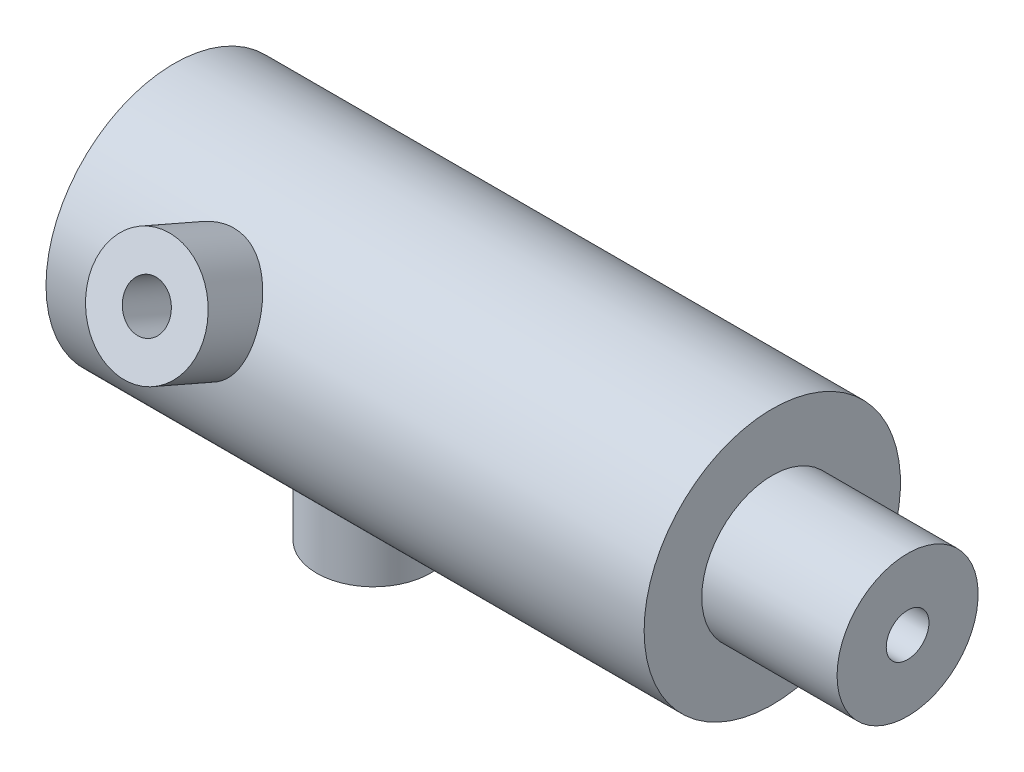
ISO-10303-21;
HEADER;
FILE_DESCRIPTION(('STEP AP214'),'2;1');
FILE_NAME('part.step','',(''),(''),'','','');
FILE_SCHEMA(('AUTOMOTIVE_DESIGN { 1 0 10303 214 1 1 1 1 }'));
ENDSEC;
DATA;
#1=APPLICATION_CONTEXT('core data for automotive mechanical design processes');
#2=APPLICATION_PROTOCOL_DEFINITION('international standard','automotive_design',2000,#1);
#3=PRODUCT_CONTEXT('',#1,'mechanical');
#4=PRODUCT('Part','Part','',(#3));
#5=PRODUCT_RELATED_PRODUCT_CATEGORY('part','',(#4));
#6=PRODUCT_DEFINITION_FORMATION('','',#4);
#7=PRODUCT_DEFINITION_CONTEXT('part definition',#1,'design');
#8=PRODUCT_DEFINITION('design','',#6,#7);
#9=PRODUCT_DEFINITION_SHAPE('','',#8);
#10=(LENGTH_UNIT() NAMED_UNIT(*) SI_UNIT(.MILLI.,.METRE.));
#11=(NAMED_UNIT(*) PLANE_ANGLE_UNIT() SI_UNIT($,.RADIAN.));
#12=(NAMED_UNIT(*) SI_UNIT($,.STERADIAN.) SOLID_ANGLE_UNIT());
#13=UNCERTAINTY_MEASURE_WITH_UNIT(LENGTH_MEASURE(1.E-05),#10,'distance_accuracy_value','');
#14=(GEOMETRIC_REPRESENTATION_CONTEXT(3) GLOBAL_UNCERTAINTY_ASSIGNED_CONTEXT((#13)) GLOBAL_UNIT_ASSIGNED_CONTEXT((#10,
#11,#12)) REPRESENTATION_CONTEXT('',''));
#15=CARTESIAN_POINT('',(0.,0.,0.));
#16=DIRECTION('',(0.,0.,1.));
#17=DIRECTION('',(1.,0.,0.));
#18=AXIS2_PLACEMENT_3D('',#15,#16,#17);
#19=CARTESIAN_POINT('',(-300.,0.,0.));
#20=DIRECTION('',(-1.,0.,0.));
#21=DIRECTION('',(0.,0.,1.));
#22=AXIS2_PLACEMENT_3D('',#19,#20,#21);
#23=CYLINDRICAL_SURFACE('',#22,5.);
#24=CARTESIAN_POINT('',(-32.,2.44382561417905,4.36207707032812));
#25=CARTESIAN_POINT('',(-31.9719902179132,2.44382463275468,4.36207785568874));
#26=CARTESIAN_POINT('',(-31.9439619157941,2.44175566384853,4.36323874560043));
#27=CARTESIAN_POINT('',(-31.8886824068532,2.43352551554042,4.3678341224768));
#28=CARTESIAN_POINT('',(-31.8614320909813,2.42735982634019,4.37127111503287));
#29=CARTESIAN_POINT('',(-31.808517090391,2.41109414480081,4.38026378861444));
#30=CARTESIAN_POINT('',(-31.7828514553043,2.40099653760197,4.38581818515895));
#31=CARTESIAN_POINT('',(-31.7338161038541,2.37712253104768,4.39880350084775));
#32=CARTESIAN_POINT('',(-31.7104459327581,2.36334686233681,4.40623404728015));
#33=CARTESIAN_POINT('',(-31.6665743681713,2.33240978051684,4.42268828494558));
#34=CARTESIAN_POINT('',(-31.6460824952481,2.31523756360443,4.43171704993643));
#35=CARTESIAN_POINT('',(-31.6086311954982,2.27796902355845,4.4509882388944));
#36=CARTESIAN_POINT('',(-31.5916719302968,2.25787256670523,4.46123071835827));
#37=CARTESIAN_POINT('',(-31.5617343714964,2.21522776625406,4.48255893760507));
#38=CARTESIAN_POINT('',(-31.5487645006032,2.19267436940354,4.49364640067073));
#39=CARTESIAN_POINT('',(-31.5272277834257,2.14574907747121,4.51624161171895));
#40=CARTESIAN_POINT('',(-31.5186608298153,2.12137722673287,4.52774934944951));
#41=CARTESIAN_POINT('',(-31.5062010453234,2.07156630569769,4.55075408145723));
#42=CARTESIAN_POINT('',(-31.502292583625,2.04613110240243,4.56225098159007));
#43=CARTESIAN_POINT('',(-31.4992123654331,1.99483060667151,4.58491406916804));
#44=CARTESIAN_POINT('',(-31.5000404861269,1.96896532540449,4.5960802651803));
#45=CARTESIAN_POINT('',(-31.5063972363251,1.91763947835882,4.6177301901766));
#46=CARTESIAN_POINT('',(-31.5119090577819,1.89217779661695,4.62821621539151));
#47=CARTESIAN_POINT('',(-31.5274505644733,1.84230274731549,4.64829471637029));
#48=CARTESIAN_POINT('',(-31.5374803083938,1.81788939337778,4.65788718052521));
#49=CARTESIAN_POINT('',(-31.5617913816272,1.77078605672388,4.67599778332356));
#50=CARTESIAN_POINT('',(-31.5760801487651,1.74809917680052,4.6845140050927));
#51=CARTESIAN_POINT('',(-31.6084982616682,1.7051705524166,4.70031035009157));
#52=CARTESIAN_POINT('',(-31.6266277200726,1.68492887969602,4.70759043705685));
#53=CARTESIAN_POINT('',(-31.6663071147568,1.64741902524983,4.72084832320064));
#54=CARTESIAN_POINT('',(-31.6878716723708,1.63016424361026,4.72682028395315));
#55=CARTESIAN_POINT('',(-31.7337584326054,1.59927162738725,4.73736187595038));
#56=CARTESIAN_POINT('',(-31.7580806392261,1.5856337980504,4.74193150516095));
#57=CARTESIAN_POINT('',(-31.8088035125999,1.56240463774082,4.74963601591324));
#58=CARTESIAN_POINT('',(-31.8352046162114,1.55281415998372,4.75277059494616));
#59=CARTESIAN_POINT('',(-31.8893303023073,1.53799533502983,4.75758674149503));
#60=CARTESIAN_POINT('',(-31.9170548444437,1.53276685493748,4.7592683532781));
#61=CARTESIAN_POINT('',(-31.9729120897648,1.5268569805032,4.76116766531805));
#62=CARTESIAN_POINT('',(-32.0010425101324,1.52615602535207,4.7613916631109));
#63=CARTESIAN_POINT('',(-32.0570256329114,1.52927223396259,4.76039168632797));
#64=CARTESIAN_POINT('',(-32.0848783390702,1.53308933667538,4.75916773131721));
#65=CARTESIAN_POINT('',(-32.1394557911392,1.54510339257999,4.75528073003278));
#66=CARTESIAN_POINT('',(-32.1661827855473,1.55329111989491,4.75262071497982));
#67=CARTESIAN_POINT('',(-32.2178200258652,1.57377679328526,4.74587633809813));
#68=CARTESIAN_POINT('',(-32.2427302301436,1.58607483351131,4.74179194364255));
#69=CARTESIAN_POINT('',(-32.2901199870144,1.61444185664411,4.73220894895131));
#70=CARTESIAN_POINT('',(-32.3125909709831,1.63052354191195,4.72670557886274));
#71=CARTESIAN_POINT('',(-32.354377526637,1.66593649906017,4.71434050717992));
#72=CARTESIAN_POINT('',(-32.37369302017,1.68526785140115,4.70747877195228));
#73=CARTESIAN_POINT('',(-32.408690816699,1.72666731928342,4.69245199325041));
#74=CARTESIAN_POINT('',(-32.4243597797931,1.74874504358373,4.68428234344168));
#75=CARTESIAN_POINT('',(-32.4515279342532,1.79491566857954,4.66678544357369));
#76=CARTESIAN_POINT('',(-32.4630271827535,1.81900854165747,4.65745820937826));
#77=CARTESIAN_POINT('',(-32.4815068838277,1.86844641721031,4.63784576255884));
#78=CARTESIAN_POINT('',(-32.4884953936626,1.89378909954522,4.62756229581079));
#79=CARTESIAN_POINT('',(-32.4977815347899,1.94502034251962,4.60626367545235));
#80=CARTESIAN_POINT('',(-32.500079297917,1.97090888779684,4.59524854241463));
#81=CARTESIAN_POINT('',(-32.49991686678,2.02236904281403,4.57283366616371));
#82=CARTESIAN_POINT('',(-32.4974773815817,2.04794154241693,4.56143581006097));
#83=CARTESIAN_POINT('',(-32.4879531271715,2.09816560968047,4.53855295275411));
#84=CARTESIAN_POINT('',(-32.4808683543135,2.12281717661823,4.52706795148159));
#85=CARTESIAN_POINT('',(-32.4622603713035,2.17052260392725,4.50439004424814));
#86=CARTESIAN_POINT('',(-32.4507377665329,2.19357668171213,4.49319709866905));
#87=CARTESIAN_POINT('',(-32.4235834155415,2.23748091391932,4.47149634754273));
#88=CARTESIAN_POINT('',(-32.4079516933644,2.25833108123641,4.460988537987));
#89=CARTESIAN_POINT('',(-32.3729451904881,2.29737405692767,4.44100846885508));
#90=CARTESIAN_POINT('',(-32.3535549918776,2.31555535791982,4.43154073548685));
#91=CARTESIAN_POINT('',(-32.3116123242273,2.34869817053577,4.41406489798094));
#92=CARTESIAN_POINT('',(-32.2890590974155,2.36365890842022,4.40605714467363));
#93=CARTESIAN_POINT('',(-32.24136782904,2.39001199319932,4.39181833548115));
#94=CARTESIAN_POINT('',(-32.216223359338,2.40139516774225,4.38559185011319));
#95=CARTESIAN_POINT('',(-32.1641258543769,2.42024323287729,4.37521879375576));
#96=CARTESIAN_POINT('',(-32.1371748980372,2.42771254313307,4.37106987694381));
#97=CARTESIAN_POINT('',(-32.0917261295504,2.43668705630269,4.36607051217117));
#98=CARTESIAN_POINT('',(-32.0735188743468,2.4393607659495,4.36457595795929));
#99=CARTESIAN_POINT('',(-32.0368770884787,2.44293036425719,4.36257898056657));
#100=CARTESIAN_POINT('',(-32.0184425587687,2.44382626038103,4.36207655322095));
#101=CARTESIAN_POINT('',(-32.,2.44382561417905,4.36207707032812));
#102=B_SPLINE_CURVE_WITH_KNOTS('',3,(#24,#25,#26,#27,#28,#29,#30,#31,#32,#33,#34,#35,#36,#37,
#38,#39,#40,#41,#42,#43,#44,#45,#46,#47,#48,#49,#50,#51,#52,#53,#54,#55,#56,#57,#58,#59,#60,#61,
#62,#63,#64,#65,#66,#67,#68,#69,#70,#71,#72,#73,#74,#75,#76,#77,#78,#79,#80,#81,#82,#83,#84,#85,
#86,#87,#88,#89,#90,#91,#92,#93,#94,#95,#96,#97,#98,#99,#100,#101),.UNSPECIFIED.,.T.,.F.,(4,2,2,
2,2,2,2,2,2,2,2,2,2,2,2,2,2,2,2,2,2,2,2,2,2,2,2,2,2,2,2,2,2,2,2,2,2,2,4),(0.,0.0839619972182352,
0.168016575910885,0.252020245498734,0.336007240210655,0.420265807649624,0.504528229276266,
0.58896734985646,0.673404412038973,0.757557354492248,0.841708114991162,0.925558159093309,
1.00940929240487,1.09340772733207,1.17740862609265,1.26177712542501,1.34614574713782,
1.43053214558967,1.51491597297516,1.59893498153883,1.68295285483436,1.76679407352264,
1.85063721280524,1.93476594905859,2.01889676861602,2.10333068409059,2.18776344259003,
2.27204496347181,2.35632411556575,2.44023566734242,2.52414728498329,2.60804745997623,
2.691947144054,2.77619857518995,2.86047022517263,2.94495620535238,3.02934657447,
3.08463013803023,3.13991346951908),.UNSPECIFIED.);
#103=CARTESIAN_POINT('',(-32.,2.44382561417905,4.36207707032812));
#104=VERTEX_POINT('',#103);
#105=EDGE_CURVE('E118',#104,#104,#102,.T.);
#106=ORIENTED_EDGE('',*,*,#105,.F.);
#107=EDGE_LOOP('',(#106));
#108=FACE_BOUND('',#107,.T.);
#109=CARTESIAN_POINT('',(-6.00000000000001,0.,0.));
#110=DIRECTION('',(-1.,0.,0.));
#111=DIRECTION('',(0.,0.,1.));
#112=AXIS2_PLACEMENT_3D('',#109,#110,#111);
#113=CIRCLE('',#112,5.);
#114=CARTESIAN_POINT('',(-6.00000000000001,0.,5.));
#115=VERTEX_POINT('',#114);
#116=EDGE_CURVE('E178',#115,#115,#113,.T.);
#117=ORIENTED_EDGE('',*,*,#116,.F.);
#118=EDGE_LOOP('',(#117));
#119=FACE_BOUND('',#118,.T.);
#120=CARTESIAN_POINT('',(-33.4,0.,0.));
#121=DIRECTION('',(-1.,0.,0.));
#122=DIRECTION('',(0.,0.,1.));
#123=AXIS2_PLACEMENT_3D('',#120,#121,#122);
#124=CIRCLE('',#123,5.);
#125=CARTESIAN_POINT('',(-33.4,0.,5.));
#126=VERTEX_POINT('',#125);
#127=EDGE_CURVE('E172',#126,#126,#124,.T.);
#128=ORIENTED_EDGE('',*,*,#127,.T.);
#129=EDGE_LOOP('',(#128));
#130=FACE_BOUND('',#129,.T.);
#131=CARTESIAN_POINT('',(-28.,-4.9749371855331,0.5));
#132=CARTESIAN_POINT('',(-28.0280097820868,-4.97493751398451,0.499998786696756));
#133=CARTESIAN_POINT('',(-28.0560380842059,-4.97517628497109,0.497638429491238));
#134=CARTESIAN_POINT('',(-28.1113175931468,-4.9761054377906,0.488258157381782));
#135=CARTESIAN_POINT('',(-28.1385679090187,-4.9767963173061,0.481233107443218));
#136=CARTESIAN_POINT('',(-28.191482909609,-4.97855066523694,0.462730058034464));
#137=CARTESIAN_POINT('',(-28.2171485446957,-4.97961390773395,0.451254758146952));
#138=CARTESIAN_POINT('',(-28.2661838961459,-4.9819929028591,0.424182133695553));
#139=CARTESIAN_POINT('',(-28.2895540672419,-4.98330860532165,0.408585627812964));
#140=CARTESIAN_POINT('',(-28.3334256318288,-4.98604963354949,0.373652380999351));
#141=CARTESIAN_POINT('',(-28.3539175047519,-4.98747530002633,0.354303709054128));
#142=CARTESIAN_POINT('',(-28.3913688045018,-4.99027252617859,0.312440857659781));
#143=CARTESIAN_POINT('',(-28.4083280697032,-4.99164408337606,0.289926533453284));
#144=CARTESIAN_POINT('',(-28.4382656285036,-4.99418191577802,0.242313180825495));
#145=CARTESIAN_POINT('',(-28.4512354993968,-4.99534775447323,0.217208831264785));
#146=CARTESIAN_POINT('',(-28.4727722165743,-4.99733908437885,0.165164992143755));
#147=CARTESIAN_POINT('',(-28.4813391701847,-4.99816458388532,0.13822554733411));
#148=CARTESIAN_POINT('',(-28.4937989546766,-4.99937983285513,0.0833723913714751));
#149=CARTESIAN_POINT('',(-28.497707416375,-4.99977103921408,0.0554622635157911));
#150=CARTESIAN_POINT('',(-28.5007876345669,-5.00007857799346,-0.000620370344471064));
#151=CARTESIAN_POINT('',(-28.4999595138731,-4.99999492272636,-0.0287928695272302));
#152=CARTESIAN_POINT('',(-28.4936027636749,-4.99936335655593,-0.0844944220322795));
#153=CARTESIAN_POINT('',(-28.4880909422181,-4.99881710575856,-0.112025414967489));
#154=CARTESIAN_POINT('',(-28.4725494355267,-4.99732364632465,-0.165769589752266));
#155=CARTESIAN_POINT('',(-28.4625196916062,-4.99637643247977,-0.191982754478865));
#156=CARTESIAN_POINT('',(-28.4382086183728,-4.99418468741958,-0.242400157339793));
#157=CARTESIAN_POINT('',(-28.4239198512349,-4.99293963682879,-0.266600785490824));
#158=CARTESIAN_POINT('',(-28.3915017383318,-4.99029192259704,-0.312266756587096));
#159=CARTESIAN_POINT('',(-28.3733722799274,-4.98888925433406,-0.333732019280414));
#160=CARTESIAN_POINT('',(-28.3336928852432,-4.98607646733926,-0.373416385911345));
#161=CARTESIAN_POINT('',(-28.3121283276292,-4.98466634286514,-0.391620873095172));
#162=CARTESIAN_POINT('',(-28.2662415673946,-4.98200369964111,-0.424153767678959));
#163=CARTESIAN_POINT('',(-28.2419193607739,-4.98075118111982,-0.438482169456446));
#164=CARTESIAN_POINT('',(-28.1911964874001,-4.97854544757075,-0.462856092286616));
#165=CARTESIAN_POINT('',(-28.1647953837886,-4.97759229566277,-0.47290071028648));
#166=CARTESIAN_POINT('',(-28.1106696976927,-4.97609450935469,-0.488410367818795));
#167=CARTESIAN_POINT('',(-28.0829451555563,-4.97554986250884,-0.493875546871517));
#168=CARTESIAN_POINT('',(-28.0270879102352,-4.97493290263708,-0.50005238769598));
#169=CARTESIAN_POINT('',(-27.9989574898676,-4.97485855773802,-0.500784498323606));
#170=CARTESIAN_POINT('',(-27.9429743670886,-4.97518525677386,-0.497528123435681));
#171=CARTESIAN_POINT('',(-27.9151216609298,-4.97558629428531,-0.493539701704878));
#172=CARTESIAN_POINT('',(-27.8605442088608,-4.97681672211201,-0.48097258725376));
#173=CARTESIAN_POINT('',(-27.8338172144527,-4.97764521000673,-0.472403563594454));
#174=CARTESIAN_POINT('',(-27.7821799741348,-4.97963645519397,-0.450928359837969));
#175=CARTESIAN_POINT('',(-27.7572697698564,-4.98079922014335,-0.438022080391793));
#176=CARTESIAN_POINT('',(-27.7098800129856,-4.98333292177857,-0.408187500711608));
#177=CARTESIAN_POINT('',(-27.6874090290169,-4.98470455407336,-0.391245649920345));
#178=CARTESIAN_POINT('',(-27.645622473363,-4.98749916312593,-0.353840266725586));
#179=CARTESIAN_POINT('',(-27.62630697983,-4.98892214115433,-0.333376647124067));
#180=CARTESIAN_POINT('',(-27.591309183301,-4.99166523924651,-0.289419902113237));
#181=CARTESIAN_POINT('',(-27.5756402202069,-4.99298497027737,-0.265916127984726));
#182=CARTESIAN_POINT('',(-27.5484720657468,-4.99536721053315,-0.216598858708566));
#183=CARTESIAN_POINT('',(-27.5369728172464,-4.99642972328246,-0.190785395214813));
#184=CARTESIAN_POINT('',(-27.5184931161723,-4.99817605207003,-0.137628063216408));
#185=CARTESIAN_POINT('',(-27.5115046063374,-4.99886054302824,-0.11028701882498));
#186=CARTESIAN_POINT('',(-27.5022184652101,-4.99977647306824,-0.0548124069918401));
#187=CARTESIAN_POINT('',(-27.499920702083,-5.00000792488281,-0.0266788618461092));
#188=CARTESIAN_POINT('',(-27.50008313322,-4.99999169156635,0.0294511120378731));
#189=CARTESIAN_POINT('',(-27.5025226184183,-4.99974609188335,0.0574476036122638));
#190=CARTESIAN_POINT('',(-27.5120468728285,-4.99880746788795,0.112630944178181));
#191=CARTESIAN_POINT('',(-27.5191316456865,-4.99811444322437,0.139817792534182));
#192=CARTESIAN_POINT('',(-27.5377396286965,-4.99635861906981,0.192609954383872));
#193=CARTESIAN_POINT('',(-27.5492622334671,-4.99529587001624,0.218215483038765));
#194=CARTESIAN_POINT('',(-27.5764165844585,-4.99291906208148,0.267132300077399));
#195=CARTESIAN_POINT('',(-27.5920483066356,-4.99160500467077,0.29044360188428));
#196=CARTESIAN_POINT('',(-27.6270548095119,-4.98886592334527,0.334216362213469));
#197=CARTESIAN_POINT('',(-27.6464450081224,-4.9874404573035,0.35466546310967));
#198=CARTESIAN_POINT('',(-27.6883876757727,-4.98464295384829,0.392028879696571));
#199=CARTESIAN_POINT('',(-27.7109409025845,-4.98327092933888,0.408942345923924));
#200=CARTESIAN_POINT('',(-27.75863217096,-4.980731917053,0.438788320212027));
#201=CARTESIAN_POINT('',(-27.783776640662,-4.97956545962653,0.451710593997417));
#202=CARTESIAN_POINT('',(-27.8358741456231,-4.97757597381231,0.473132354049384));
#203=CARTESIAN_POINT('',(-27.8628251019629,-4.9767525582668,0.481636828944929));
#204=CARTESIAN_POINT('',(-27.9082738704496,-4.97575003769072,0.491860844166765));
#205=CARTESIAN_POINT('',(-27.9264811256532,-4.97544665967847,0.494908856199113));
#206=CARTESIAN_POINT('',(-27.9631229115213,-4.97504012588832,0.498978829302557));
#207=CARTESIAN_POINT('',(-27.9815574412313,-4.97493696926992,0.500000798878632));
#208=CARTESIAN_POINT('',(-28.,-4.9749371855331,0.5));
#209=B_SPLINE_CURVE_WITH_KNOTS('',3,(#131,#132,#133,#134,#135,#136,#137,#138,#139,#140,#141,
#142,#143,#144,#145,#146,#147,#148,#149,#150,#151,#152,#153,#154,#155,#156,#157,#158,#159,#160,
#161,#162,#163,#164,#165,#166,#167,#168,#169,#170,#171,#172,#173,#174,#175,#176,#177,#178,#179,
#180,#181,#182,#183,#184,#185,#186,#187,#188,#189,#190,#191,#192,#193,#194,#195,#196,#197,#198,
#199,#200,#201,#202,#203,#204,#205,#206,#207,#208),.UNSPECIFIED.,.T.,.F.,(4,2,2,2,2,2,2,2,2,2,2,
2,2,2,2,2,2,2,2,2,2,2,2,2,2,2,2,2,2,2,2,2,2,2,2,2,2,2,4),(0.,0.0839619972182282,
0.168016575910885,0.25202024549873,0.336007240210658,0.420265807649628,0.504528229276264,
0.588967349856459,0.673404412038974,0.757557354492248,0.841708114991162,0.925558159093308,
1.00940929240487,1.09340772733207,1.17740862609264,1.26177712542501,1.34614574713782,
1.43053214558967,1.51491597297517,1.59893498153883,1.68295285483435,1.76679407352264,
1.85063721280524,1.93476594905859,2.01889676861601,2.10333068409059,2.18776344259003,
2.27204496347181,2.35632411556575,2.44023566734242,2.52414728498329,2.60804745997623,
2.691947144054,2.77619857518994,2.86047022517263,2.94495620535238,3.02934657447,
3.08463013803023,3.13991346951908),.UNSPECIFIED.);
#210=CARTESIAN_POINT('',(-28.,-4.9749371855331,0.5));
#211=VERTEX_POINT('',#210);
#212=EDGE_CURVE('E111',#211,#211,#209,.T.);
#213=ORIENTED_EDGE('',*,*,#212,.T.);
#214=EDGE_LOOP('',(#213));
#215=FACE_BOUND('',#214,.T.);
#216=ADVANCED_FACE('F39',(#108,#119,#130,#215),#23,.F.);
#217=CARTESIAN_POINT('',(-300.,0.,0.));
#218=DIRECTION('',(-1.,0.,0.));
#219=DIRECTION('',(0.,0.,1.));
#220=AXIS2_PLACEMENT_3D('',#217,#218,#219);
#221=CYLINDRICAL_SURFACE('',#220,9.);
#222=CARTESIAN_POINT('',(-30.2393296158438,0.,9.));
#223=CARTESIAN_POINT('',(-30.4235561390122,-0.0984828176639037,9.00000231285291));
#224=CARTESIAN_POINT('',(-30.6156667914756,-0.182675235593167,8.99839832618781));
#225=CARTESIAN_POINT('',(-31.0113257230997,-0.318359545661707,8.9946271078043));
#226=CARTESIAN_POINT('',(-31.2148850644662,-0.369819198002516,8.99245932373027));
#227=CARTESIAN_POINT('',(-31.6283811205412,-0.437042379479529,8.98944754321755));
#228=CARTESIAN_POINT('',(-31.8383309887987,-0.452726416157788,8.98860649602801));
#229=CARTESIAN_POINT('',(-32.2576532712676,-0.447114001741825,8.98888741225496));
#230=CARTESIAN_POINT('',(-32.4670258644272,-0.425830712225916,8.99000867702523));
#231=CARTESIAN_POINT('',(-32.8717355430597,-0.349073817235021,8.99330383673725));
#232=CARTESIAN_POINT('',(-33.0673074696156,-0.294818142394322,8.99543966831117));
#233=CARTESIAN_POINT('',(-33.4474007969049,-0.156057549304492,8.99891253254977));
#234=CARTESIAN_POINT('',(-33.6319179348476,-0.0715410488310798,9.00024925883603));
#235=CARTESIAN_POINT('',(-33.9966570718408,0.129910753180555,8.99965692144847));
#236=CARTESIAN_POINT('',(-34.1759811874261,0.248466425485459,8.99753023870569));
#237=CARTESIAN_POINT('',(-34.5147236581476,0.511029693414862,8.98643944618577));
#238=CARTESIAN_POINT('',(-34.6741324096994,0.655049488116113,8.97747205237927));
#239=CARTESIAN_POINT('',(-34.9834082935315,0.978136253509663,8.94828871484558));
#240=CARTESIAN_POINT('',(-35.1311134980275,1.15919374844104,8.9271300258526));
#241=CARTESIAN_POINT('',(-35.3954482970851,1.54073172473393,8.86922922085053));
#242=CARTESIAN_POINT('',(-35.5120775734052,1.74121240497511,8.83248694526353));
#243=CARTESIAN_POINT('',(-35.6603398708642,2.05069529039016,8.76389299316646));
#244=CARTESIAN_POINT('',(-35.7052338953515,2.1550428261127,8.73886143855703));
#245=CARTESIAN_POINT('',(-35.7859089698193,2.36599286847576,8.68411868188405));
#246=CARTESIAN_POINT('',(-35.8216941029039,2.47259434148667,8.65440958625101));
#247=CARTESIAN_POINT('',(-35.8837411393167,2.68708355860963,8.59023375569284));
#248=CARTESIAN_POINT('',(-35.9100062746123,2.79497085332299,8.55576864089708));
#249=CARTESIAN_POINT('',(-35.9527111226917,3.01108074021771,8.48212339111049));
#250=CARTESIAN_POINT('',(-35.969151665933,3.11930330328182,8.44294365497565));
#251=CARTESIAN_POINT('',(-35.9910742342578,3.32638020020521,8.36340187147974));
#252=CARTESIAN_POINT('',(-35.9973319447952,3.42528730562933,8.32338895195101));
#253=CARTESIAN_POINT('',(-36.0012929034802,3.62179117249342,8.23978359815752));
#254=CARTESIAN_POINT('',(-35.9989933116943,3.71938748813194,8.19618998025202));
#255=CARTESIAN_POINT('',(-35.9858586634378,3.91244681057806,8.10580699093844));
#256=CARTESIAN_POINT('',(-35.9750280460004,4.00791090030898,8.05901929309836));
#257=CARTESIAN_POINT('',(-35.9449675159082,4.19608833777943,7.96266590303146));
#258=CARTESIAN_POINT('',(-35.9257344531754,4.28880063993868,7.91309917502654));
#259=CARTESIAN_POINT('',(-35.8572856487237,4.55567897348782,7.76441459737538));
#260=CARTESIAN_POINT('',(-35.7968251983869,4.72533941251142,7.66211760039383));
#261=CARTESIAN_POINT('',(-35.6474257667006,5.04849482851234,7.4531781058615));
#262=CARTESIAN_POINT('',(-35.5584811321975,5.20198658850719,7.3465347493742));
#263=CARTESIAN_POINT('',(-35.3491391676437,5.49867360976698,7.12744071721601));
#264=CARTESIAN_POINT('',(-35.2272837538729,5.64084170504867,7.01499248359438));
#265=CARTESIAN_POINT('',(-34.9579180173468,5.90345172112334,6.79548503750362));
#266=CARTESIAN_POINT('',(-34.8103937336068,6.02388174584643,6.688428798745));
#267=CARTESIAN_POINT('',(-34.4807747535289,6.25038231251552,6.47753372104196));
#268=CARTESIAN_POINT('',(-34.2969097273534,6.35467908008095,6.37454992082511));
#269=CARTESIAN_POINT('',(-33.9069287920873,6.53624565809206,6.18825467953637));
#270=CARTESIAN_POINT('',(-33.7008139484343,6.61351676191709,6.10494229710261));
#271=CARTESIAN_POINT('',(-33.3803995008468,6.70794006452549,6.00047399097602));
#272=CARTESIAN_POINT('',(-33.2723595886317,6.73573669110816,5.96918751533824));
#273=CARTESIAN_POINT('',(-33.0529211779943,6.78435452278729,5.91387326736596));
#274=CARTESIAN_POINT('',(-32.941524316556,6.80517906962193,5.88984201812449));
#275=CARTESIAN_POINT('',(-32.7163041178145,6.83973031031559,5.84968301538906));
#276=CARTESIAN_POINT('',(-32.6024822625769,6.85346121691575,5.8335505712842));
#277=CARTESIAN_POINT('',(-32.3733340341298,6.87375764121693,5.8096217810236));
#278=CARTESIAN_POINT('',(-32.2580078173145,6.88032389784528,5.80182457521339));
#279=CARTESIAN_POINT('',(-32.0381336796019,6.88595914966896,5.7951341671358));
#280=CARTESIAN_POINT('',(-31.9336256131019,6.88569372863736,5.79545048446642));
#281=CARTESIAN_POINT('',(-31.7250094483853,6.87928687216612,5.80305412019058));
#282=CARTESIAN_POINT('',(-31.6209014917374,6.87314352026664,5.81034371217332));
#283=CARTESIAN_POINT('',(-31.4139334102347,6.85501354381563,5.83172241130795));
#284=CARTESIAN_POINT('',(-31.311072879758,6.84302887388551,5.84580924395193));
#285=CARTESIAN_POINT('',(-31.107281095183,6.81328407484091,5.88044832798825));
#286=CARTESIAN_POINT('',(-31.0063506048308,6.7955217075081,5.90100308488463));
#287=CARTESIAN_POINT('',(-30.7121574246124,6.7346402973155,5.97062952965895));
#288=CARTESIAN_POINT('',(-30.5224537711386,6.68347858207214,6.02822201066103));
#289=CARTESIAN_POINT('',(-30.1572098447466,6.56011964310212,6.162229417225));
#290=CARTESIAN_POINT('',(-29.981674276596,6.48791546824707,6.2386505613221));
#291=CARTESIAN_POINT('',(-29.633093653015,6.3158182896396,6.41300945584598));
#292=CARTESIAN_POINT('',(-29.4616195182722,6.21405123263384,6.51224702176906));
#293=CARTESIAN_POINT('',(-29.1423799415287,5.98707605957154,6.72151634454244));
#294=CARTESIAN_POINT('',(-28.9946259765738,5.86185665916327,6.83155328544761));
#295=CARTESIAN_POINT('',(-28.717282739969,5.57981898432159,7.0640636865327));
#296=CARTESIAN_POINT('',(-28.5895070592043,5.42147230910818,7.18688017774785));
#297=CARTESIAN_POINT('',(-28.4240308624172,5.16655036365339,7.37006105040401));
#298=CARTESIAN_POINT('',(-28.3732196155146,5.07863230106785,7.43097471038153));
#299=CARTESIAN_POINT('',(-28.2807824108801,4.89737329529736,7.55165898251189));
#300=CARTESIAN_POINT('',(-28.2391518132803,4.80403512169055,7.61143015805712));
#301=CARTESIAN_POINT('',(-28.1671480565731,4.61667711316375,7.72643816169967));
#302=CARTESIAN_POINT('',(-28.1363605192005,4.52286756179997,7.78175881759973));
#303=CARTESIAN_POINT('',(-28.0839419046558,4.33139926810354,7.88993410028224));
#304=CARTESIAN_POINT('',(-28.0623066084224,4.23374232211438,7.94278985333155));
#305=CARTESIAN_POINT('',(-28.0284379708565,4.03526837889137,8.04543900534953));
#306=CARTESIAN_POINT('',(-28.0162023873605,3.9344521412357,8.09523313201553));
#307=CARTESIAN_POINT('',(-28.001279086794,3.73044103748339,8.19124630828066));
#308=CARTESIAN_POINT('',(-27.9985907940445,3.62724631518142,8.23746557327109));
#309=CARTESIAN_POINT('',(-28.0026332528119,3.42730512003346,8.3225277197959));
#310=CARTESIAN_POINT('',(-28.008659893732,3.3306685379846,8.36166438352785));
#311=CARTESIAN_POINT('',(-28.0288197384446,3.13680414802075,8.43630564435317));
#312=CARTESIAN_POINT('',(-28.0429556041905,3.03957615634251,8.47180904427085));
#313=CARTESIAN_POINT('',(-28.0791816573305,2.84533623752076,8.53900534333915));
#314=CARTESIAN_POINT('',(-28.1012680603106,2.7483242296383,8.57070004585218));
#315=CARTESIAN_POINT('',(-28.1531688497963,2.55518142385962,8.63025422426763));
#316=CARTESIAN_POINT('',(-28.1829861720735,2.4590509751199,8.65811223704264));
#317=CARTESIAN_POINT('',(-28.2836048527234,2.17317030129684,8.73591283652239));
#318=CARTESIAN_POINT('',(-28.3656205840759,1.98567827891349,8.78016809568943));
#319=CARTESIAN_POINT('',(-28.5568747012223,1.62215071522321,8.85455816166024));
#320=CARTESIAN_POINT('',(-28.6661347200687,1.44612441892268,8.88468169227422));
#321=CARTESIAN_POINT('',(-28.9181631896761,1.09742679488792,8.93470398182938));
#322=CARTESIAN_POINT('',(-29.0628267157757,0.925991221718804,8.95366942084609));
#323=CARTESIAN_POINT('',(-29.3768109793132,0.606863363961616,8.98094395235374));
#324=CARTESIAN_POINT('',(-29.546090421541,0.459132169631918,8.98927066762375));
#325=CARTESIAN_POINT('',(-29.8073182648218,0.265290064090613,8.9962932678822));
#326=CARTESIAN_POINT('',(-29.8909326186324,0.207786570054843,8.99776571228264));
#327=CARTESIAN_POINT('',(-30.0621870357187,0.0990635814719013,8.9996186255153));
#328=CARTESIAN_POINT('',(-30.1498278990874,0.0478453433323886,8.99999887635991));
#329=CARTESIAN_POINT('',(-30.2393296158438,0.,9.));
#330=B_SPLINE_CURVE_WITH_KNOTS('',3,(#222,#223,#224,#225,#226,#227,#228,#229,#230,#231,#232,
#233,#234,#235,#236,#237,#238,#239,#240,#241,#242,#243,#244,#245,#246,#247,#248,#249,#250,#251,
#252,#253,#254,#255,#256,#257,#258,#259,#260,#261,#262,#263,#264,#265,#266,#267,#268,#269,#270,
#271,#272,#273,#274,#275,#276,#277,#278,#279,#280,#281,#282,#283,#284,#285,#286,#287,#288,#289,
#290,#291,#292,#293,#294,#295,#296,#297,#298,#299,#300,#301,#302,#303,#304,#305,#306,#307,#308,
#309,#310,#311,#312,#313,#314,#315,#316,#317,#318,#319,#320,#321,#322,#323,#324,#325,#326,#327,
#328,#329),.UNSPECIFIED.,.T.,.F.,(4,2,2,2,2,2,2,2,2,2,2,2,2,2,2,2,2,2,2,2,2,2,2,2,2,2,2,2,2,2,2,
2,2,2,2,2,2,2,2,2,2,2,2,2,2,2,2,2,2,2,2,2,2,4),(0.,0.626346633869678,1.25330922999685,
1.88166356878751,2.5097942387178,3.11602488672738,3.72248781585526,4.36478242175695,
5.00738556909375,5.70802393213693,6.40866946997912,6.7572407625834,7.10565553018873,
7.45395190257565,7.8022188298496,8.12244760566157,8.44278266608188,8.76295115341069,
9.08323977509392,9.70164544835397,10.3201739305031,10.9726428221055,11.625467699202,
12.3276440630916,13.0297868180114,13.3769740169225,13.7239945689652,14.0708087963119,
14.4175872515352,14.730720878925,15.0439566362325,15.3570876504996,15.6703401131366,
16.2817636800022,16.893389452819,17.5586990400463,18.2243295745293,18.9333795759709,
19.2882260892675,19.6428928512763,19.9819707202864,20.3208921081264,20.6597326261172,
20.9985527124782,21.311479908025,21.6245098846257,21.9373910571936,22.2503912190215,
22.8755884176312,23.5012836375052,24.1737793581341,24.8451596560451,25.1493933374692,
25.4536877357555),.UNSPECIFIED.);
#331=CARTESIAN_POINT('',(-30.2393296158438,0.,9.));
#332=VERTEX_POINT('',#331);
#333=EDGE_CURVE('E63',#332,#332,#330,.T.);
#334=ORIENTED_EDGE('',*,*,#333,.T.);
#335=EDGE_LOOP('',(#334));
#336=FACE_BOUND('',#335,.T.);
#337=CARTESIAN_POINT('',(-42.,0.,0.));
#338=DIRECTION('',(-1.,0.,0.));
#339=DIRECTION('',(0.,0.,1.));
#340=AXIS2_PLACEMENT_3D('',#337,#338,#339);
#341=CIRCLE('',#340,9.);
#342=CARTESIAN_POINT('',(-42.,0.,9.));
#343=VERTEX_POINT('',#342);
#344=EDGE_CURVE('E193',#343,#343,#341,.T.);
#345=ORIENTED_EDGE('',*,*,#344,.F.);
#346=EDGE_LOOP('',(#345));
#347=FACE_BOUND('',#346,.T.);
#348=CARTESIAN_POINT('',(0.,0.,0.));
#349=DIRECTION('',(-1.,0.,0.));
#350=DIRECTION('',(0.,0.,1.));
#351=AXIS2_PLACEMENT_3D('',#348,#349,#350);
#352=CIRCLE('',#351,9.);
#353=CARTESIAN_POINT('',(0.,0.,9.));
#354=VERTEX_POINT('',#353);
#355=EDGE_CURVE('E195',#354,#354,#352,.T.);
#356=ORIENTED_EDGE('',*,*,#355,.T.);
#357=EDGE_LOOP('',(#356));
#358=FACE_BOUND('',#357,.T.);
#359=CARTESIAN_POINT('',(-28.,-8.06225774829855,4.));
#360=CARTESIAN_POINT('',(-28.1059573708311,-8.06225871580433,3.99999911995739));
#361=CARTESIAN_POINT('',(-28.2119439780618,-8.06435392885586,3.99578365706539));
#362=CARTESIAN_POINT('',(-28.4231312346165,-8.07266315966138,3.9789689714643));
#363=CARTESIAN_POINT('',(-28.5283313785528,-8.07887962835831,3.96636475988335));
#364=CARTESIAN_POINT('',(-28.7373178958699,-8.09523141592308,3.93288406087901));
#365=CARTESIAN_POINT('',(-28.8411010778693,-8.10537442650165,3.91199133506406));
#366=CARTESIAN_POINT('',(-29.0463168971256,-8.12922894385382,3.86217443394491));
#367=CARTESIAN_POINT('',(-29.1477485166537,-8.1429419654083,3.83324684904373));
#368=CARTESIAN_POINT('',(-29.4465123074808,-8.18864631058652,3.73514516495923));
#369=CARTESIAN_POINT('',(-29.6394881758099,-8.2253027630717,3.65446024831871));
#370=CARTESIAN_POINT('',(-30.0090136628045,-8.30683459759945,3.46512080009564));
#371=CARTESIAN_POINT('',(-30.1855655991349,-8.35170881732974,3.35647022306625));
#372=CARTESIAN_POINT('',(-30.530001575505,-8.44818605812828,3.1060059734041));
#373=CARTESIAN_POINT('',(-30.6965928227612,-8.50003637535889,2.96250577387411));
#374=CARTESIAN_POINT('',(-31.0043096610349,-8.60260345288165,2.64995455081472));
#375=CARTESIAN_POINT('',(-31.1454246127768,-8.65331973187207,2.48089290635617));
#376=CARTESIAN_POINT('',(-31.4051265459258,-8.75098098504159,2.11153557580219));
#377=CARTESIAN_POINT('',(-31.522213985112,-8.79760568516485,1.9100929503113));
#378=CARTESIAN_POINT('',(-31.7202665097466,-8.87874924910097,1.48791769622052));
#379=CARTESIAN_POINT('',(-31.8012497320549,-8.91327418932817,1.26719481980238));
#380=CARTESIAN_POINT('',(-31.9199692957614,-8.96456719829754,0.826358245399125));
#381=CARTESIAN_POINT('',(-31.9599498814311,-8.98225241670698,0.606957911025229));
#382=CARTESIAN_POINT('',(-32.0028246945435,-9.00123386862955,0.163899471287845));
#383=CARTESIAN_POINT('',(-32.0057361890863,-9.00253773271409,-0.0597566030884057));
#384=CARTESIAN_POINT('',(-31.9754702291317,-8.98911726354519,-0.488489093453145));
#385=CARTESIAN_POINT('',(-31.9447715569364,-8.97549378129443,-0.693781815378674));
#386=CARTESIAN_POINT('',(-31.8524633970761,-8.93530946513216,-1.09594639688678));
#387=CARTESIAN_POINT('',(-31.7908516200437,-8.90874767303757,-1.2928176316175));
#388=CARTESIAN_POINT('',(-31.6378056813297,-8.84470124836846,-1.67619924787943));
#389=CARTESIAN_POINT('',(-31.5459312309738,-8.80705628276167,-1.86250594349001));
#390=CARTESIAN_POINT('',(-31.3354303217922,-8.72443358077163,-2.21755082089652));
#391=CARTESIAN_POINT('',(-31.2167941114569,-8.67945317314313,-2.38628256585087));
#392=CARTESIAN_POINT('',(-30.945371221115,-8.58241773900013,-2.7154801297892));
#393=CARTESIAN_POINT('',(-30.790633354692,-8.53008453462903,-2.8742540775414));
#394=CARTESIAN_POINT('',(-30.4566596958917,-8.42674548964681,-3.16444740519676));
#395=CARTESIAN_POINT('',(-30.2774117822777,-8.37574032075506,-3.29585316875555));
#396=CARTESIAN_POINT('',(-29.9892620635721,-8.30349353252504,-3.4722141239245));
#397=CARTESIAN_POINT('',(-29.8877448524811,-8.27968910382652,-3.52844732298673));
#398=CARTESIAN_POINT('',(-29.6797442948175,-8.23475847411348,-3.63207089845407));
#399=CARTESIAN_POINT('',(-29.5732631732415,-8.2136310886483,-3.67946519002082));
#400=CARTESIAN_POINT('',(-29.3560476150464,-8.17480574022009,-3.76493796299342));
#401=CARTESIAN_POINT('',(-29.245314082863,-8.15710705280262,-3.80301841278141));
#402=CARTESIAN_POINT('',(-29.0204470189975,-8.12581877041903,-3.86942100627611));
#403=CARTESIAN_POINT('',(-28.9063154081517,-8.11222690067405,-3.89774855336265));
#404=CARTESIAN_POINT('',(-28.6836732432957,-8.09048889346353,-3.94265987157493));
#405=CARTESIAN_POINT('',(-28.5753315473325,-8.08202710355241,-3.95992921027028));
#406=CARTESIAN_POINT('',(-28.3573918266728,-8.06944257855847,-3.9855114390695));
#407=CARTESIAN_POINT('',(-28.2477944190739,-8.06531779741103,-3.99382855259617));
#408=CARTESIAN_POINT('',(-28.0282276056489,-8.06156002062272,-4.00140826954622));
#409=CARTESIAN_POINT('',(-27.918258263083,-8.06192629609626,-4.00067234225206));
#410=CARTESIAN_POINT('',(-27.6988639946651,-8.06713428936378,-3.99016019475285));
#411=CARTESIAN_POINT('',(-27.5894390475257,-8.07197583075802,-3.9803843308713));
#412=CARTESIAN_POINT('',(-27.3804691628405,-8.08540695183378,-3.95302498802575));
#413=CARTESIAN_POINT('',(-27.2808160917565,-8.09367676723639,-3.9361057544652));
#414=CARTESIAN_POINT('',(-27.0833855004206,-8.11360050005856,-3.89486887060919));
#415=CARTESIAN_POINT('',(-26.9856086286792,-8.12525556590565,-3.87054870945603));
#416=CARTESIAN_POINT('',(-26.6960590639363,-8.16479240742636,-3.78682316786905));
#417=CARTESIAN_POINT('',(-26.5079130289441,-8.19725658437662,-3.71663214841266));
#418=CARTESIAN_POINT('',(-26.1376014458359,-8.27248834158665,-3.54611617116497));
#419=CARTESIAN_POINT('',(-25.956080231494,-8.31565196581231,-3.44458335178696));
#420=CARTESIAN_POINT('',(-25.6116810100325,-8.40692978437252,-3.21539109257833));
#421=CARTESIAN_POINT('',(-25.4488118298955,-8.45504630235413,-3.08771936165987));
#422=CARTESIAN_POINT('',(-25.1302412853405,-8.55631670089028,-2.79562298674897));
#423=CARTESIAN_POINT('',(-24.9766907134669,-8.6095148840855,-2.62885906790986));
#424=CARTESIAN_POINT('',(-24.6992727960391,-8.71080374842597,-2.27079015062341));
#425=CARTESIAN_POINT('',(-24.5754096456538,-8.75889370718726,-2.07948168961168));
#426=CARTESIAN_POINT('',(-24.3603130138535,-8.84519710329965,-1.67498083195632));
#427=CARTESIAN_POINT('',(-24.269367447374,-8.88332261890373,-1.46161537891358));
#428=CARTESIAN_POINT('',(-24.1254165885487,-8.94472578633532,-1.02045840345963));
#429=CARTESIAN_POINT('',(-24.0723852607135,-8.96801362591143,-0.792676897693137));
#430=CARTESIAN_POINT('',(-24.0093663016107,-8.99580137725376,-0.348228514120196));
#431=CARTESIAN_POINT('',(-23.99635916601,-9.00161841238474,-0.132069851030828));
#432=CARTESIAN_POINT('',(-24.0053897354696,-8.99760436638387,0.299340223517711));
#433=CARTESIAN_POINT('',(-24.0274196837641,-8.98777674877918,0.514591825211431));
#434=CARTESIAN_POINT('',(-24.1037447609568,-8.95431252861899,0.928153502660462));
#435=CARTESIAN_POINT('',(-24.1565648583573,-8.93130800198359,1.1267915052796));
#436=CARTESIAN_POINT('',(-24.2912477754223,-8.87418367952879,1.51223596588295));
#437=CARTESIAN_POINT('',(-24.3731156898838,-8.84006193390785,1.69904034154831));
#438=CARTESIAN_POINT('',(-24.5676964573233,-8.76198674432235,2.06499399486296));
#439=CARTESIAN_POINT('',(-24.6816510530122,-8.71765436140804,2.24339999936039));
#440=CARTESIAN_POINT('',(-24.9354703160714,-8.62423537528495,2.57934407500577));
#441=CARTESIAN_POINT('',(-25.0753459460223,-8.57514676476889,2.73687326835961));
#442=CARTESIAN_POINT('',(-25.3899201278316,-8.47281938446242,3.03954409865291));
#443=CARTESIAN_POINT('',(-25.5664938841436,-8.41955831287189,3.18273227949446));
#444=CARTESIAN_POINT('',(-25.942733643409,-8.31863267646236,3.43791440309693));
#445=CARTESIAN_POINT('',(-26.1424139599155,-8.27097161785401,3.54988886228431));
#446=CARTESIAN_POINT('',(-26.4558196346753,-8.20816019578813,3.69171847079632));
#447=CARTESIAN_POINT('',(-26.5628930647928,-8.1886311652569,3.73471557477055));
#448=CARTESIAN_POINT('',(-26.780874559849,-8.15320381153417,3.81143772284525));
#449=CARTESIAN_POINT('',(-26.8917806724244,-8.13730367028836,3.845167411606));
#450=CARTESIAN_POINT('',(-27.1162955940182,-8.10978099454029,3.90288007753841));
#451=CARTESIAN_POINT('',(-27.2298964648288,-8.09814723957673,3.9268886385568));
#452=CARTESIAN_POINT('',(-27.4590746774318,-8.07957808395543,3.96495546520188));
#453=CARTESIAN_POINT('',(-27.5746504670552,-8.07263915318077,3.9790212073577));
#454=CARTESIAN_POINT('',(-27.7421042889858,-8.06621715015364,3.99201145270215));
#455=CARTESIAN_POINT('',(-27.7936230823058,-8.06473388409385,3.99500589171351));
#456=CARTESIAN_POINT('',(-27.896758935286,-8.06275393395959,3.999000407068));
#457=CARTESIAN_POINT('',(-27.9483759975997,-8.06225727691539,4.00000042876981));
#458=CARTESIAN_POINT('',(-28.,-8.06225774829855,4.));
#459=B_SPLINE_CURVE_WITH_KNOTS('',3,(#359,#360,#361,#362,#363,#364,#365,#366,#367,#368,#369,
#370,#371,#372,#373,#374,#375,#376,#377,#378,#379,#380,#381,#382,#383,#384,#385,#386,#387,#388,
#389,#390,#391,#392,#393,#394,#395,#396,#397,#398,#399,#400,#401,#402,#403,#404,#405,#406,#407,
#408,#409,#410,#411,#412,#413,#414,#415,#416,#417,#418,#419,#420,#421,#422,#423,#424,#425,#426,
#427,#428,#429,#430,#431,#432,#433,#434,#435,#436,#437,#438,#439,#440,#441,#442,#443,#444,#445,
#446,#447,#448,#449,#450,#451,#452,#453,#454,#455,#456,#457,#458),.UNSPECIFIED.,.T.,.F.,(4,2,2,
2,2,2,2,2,2,2,2,2,2,2,2,2,2,2,2,2,2,2,2,2,2,2,2,2,2,2,2,2,2,2,2,2,2,2,2,2,2,2,2,2,2,2,2,2,2,4),
(0.,0.317818393464469,0.635825965765501,0.954459661966036,1.27322877767421,1.90722874390828,
2.54113910702096,3.21592082560628,3.89098369437126,4.60017396201825,5.30900756723244,
5.97655382465035,6.64378912192227,7.2649383209646,7.88613352796073,8.51679809150508,
9.14769283027862,9.82817138867165,10.5089876973668,10.8640051386945,11.2188649509067,
11.5736497023149,11.9282375755844,12.2578989536132,12.5874047378733,12.9168570449994,
13.2462963667916,13.5501886308043,13.8541841092442,14.4617122414652,15.0964254682774,
15.7314378394431,16.4267756477756,17.1222116573598,17.8235911742808,18.5244885941114,
19.1710234433366,19.8174151778728,20.435125469535,21.0529441571385,21.6990794243508,
22.3454885827445,23.0428199922054,23.7405857054973,24.0912600651532,24.4417583512593,
24.7913281126127,25.1406347336251,25.2954763259606,25.4503221604539),.UNSPECIFIED.);
#460=CARTESIAN_POINT('',(-28.,-8.06225774829855,4.));
#461=VERTEX_POINT('',#460);
#462=EDGE_CURVE('E10',#461,#461,#459,.T.);
#463=ORIENTED_EDGE('',*,*,#462,.F.);
#464=EDGE_LOOP('',(#463));
#465=FACE_BOUND('',#464,.T.);
#466=ADVANCED_FACE('F69',(#336,#347,#358,#465),#221,.T.);
#467=CARTESIAN_POINT('',(9.5,0.,0.));
#468=DIRECTION('',(-1.,0.,0.));
#469=DIRECTION('',(0.,0.,1.));
#470=AXIS2_PLACEMENT_3D('',#467,#468,#469);
#471=PLANE('',#470);
#472=CARTESIAN_POINT('',(9.50000000000001,0.,0.));
#473=DIRECTION('',(-1.,0.,0.));
#474=DIRECTION('',(0.,0.,1.));
#475=AXIS2_PLACEMENT_3D('',#472,#473,#474);
#476=CIRCLE('',#475,1.5);
#477=CARTESIAN_POINT('',(9.50000000000001,0.,1.5));
#478=VERTEX_POINT('',#477);
#479=EDGE_CURVE('E169',#478,#478,#476,.F.);
#480=ORIENTED_EDGE('',*,*,#479,.F.);
#481=EDGE_LOOP('',(#480));
#482=FACE_BOUND('',#481,.T.);
#483=CARTESIAN_POINT('',(9.50000000000001,0.,0.));
#484=DIRECTION('',(-1.,0.,0.));
#485=DIRECTION('',(0.,0.,1.));
#486=AXIS2_PLACEMENT_3D('',#483,#484,#485);
#487=CIRCLE('',#486,4.953);
#488=CARTESIAN_POINT('',(9.50000000000001,0.,4.953));
#489=VERTEX_POINT('',#488);
#490=EDGE_CURVE('E50',#489,#489,#487,.T.);
#491=ORIENTED_EDGE('',*,*,#490,.F.);
#492=EDGE_LOOP('',(#491));
#493=FACE_BOUND('',#492,.T.);
#494=ADVANCED_FACE('F41',(#482,#493),#471,.F.);
#495=CARTESIAN_POINT('',(-300.,0.,0.));
#496=DIRECTION('',(-1.,0.,0.));
#497=DIRECTION('',(0.,0.,1.));
#498=AXIS2_PLACEMENT_3D('',#495,#496,#497);
#499=CYLINDRICAL_SURFACE('',#498,4.953);
#500=CARTESIAN_POINT('',(0.,0.,0.));
#501=DIRECTION('',(-1.,0.,0.));
#502=DIRECTION('',(0.,0.,1.));
#503=AXIS2_PLACEMENT_3D('',#500,#501,#502);
#504=CIRCLE('',#503,4.953);
#505=CARTESIAN_POINT('',(0.,0.,4.953));
#506=VERTEX_POINT('',#505);
#507=EDGE_CURVE('E55',#506,#506,#504,.T.);
#508=ORIENTED_EDGE('',*,*,#507,.F.);
#509=EDGE_LOOP('',(#508));
#510=FACE_BOUND('',#509,.T.);
#511=ORIENTED_EDGE('',*,*,#490,.T.);
#512=EDGE_LOOP('',(#511));
#513=FACE_BOUND('',#512,.T.);
#514=ADVANCED_FACE('F89',(#510,#513),#499,.T.);
#515=CARTESIAN_POINT('',(0.,4.953,0.));
#516=DIRECTION('',(-1.,0.,0.));
#517=DIRECTION('',(0.,0.,1.));
#518=AXIS2_PLACEMENT_3D('',#515,#516,#517);
#519=PLANE('',#518);
#520=ORIENTED_EDGE('',*,*,#355,.F.);
#521=EDGE_LOOP('',(#520));
#522=FACE_BOUND('',#521,.T.);
#523=ORIENTED_EDGE('',*,*,#507,.T.);
#524=EDGE_LOOP('',(#523));
#525=FACE_BOUND('',#524,.T.);
#526=ADVANCED_FACE('F78',(#522,#525),#519,.F.);
#527=CARTESIAN_POINT('',(-42.,9.,0.));
#528=DIRECTION('',(1.,0.,0.));
#529=DIRECTION('',(0.,0.,-1.));
#530=AXIS2_PLACEMENT_3D('',#527,#528,#529);
#531=PLANE('',#530);
#532=CARTESIAN_POINT('',(-42.,0.,0.));
#533=DIRECTION('',(1.,0.,0.));
#534=DIRECTION('',(0.,0.,-1.));
#535=AXIS2_PLACEMENT_3D('',#532,#533,#534);
#536=CIRCLE('',#535,4.5);
#537=CARTESIAN_POINT('',(-42.,0.,-4.5));
#538=VERTEX_POINT('',#537);
#539=EDGE_CURVE('E168',#538,#538,#536,.F.);
#540=ORIENTED_EDGE('',*,*,#539,.F.);
#541=EDGE_LOOP('',(#540));
#542=FACE_BOUND('',#541,.T.);
#543=ORIENTED_EDGE('',*,*,#344,.T.);
#544=EDGE_LOOP('',(#543));
#545=FACE_BOUND('',#544,.T.);
#546=ADVANCED_FACE('F77',(#542,#545),#531,.F.);
#547=CARTESIAN_POINT('',(-28.,-3.,0.));
#548=DIRECTION('',(0.,1.,0.));
#549=DIRECTION('',(0.,0.,1.));
#550=AXIS2_PLACEMENT_3D('',#547,#548,#549);
#551=CYLINDRICAL_SURFACE('',#550,4.);
#552=CARTESIAN_POINT('',(-28.,-13.,0.));
#553=DIRECTION('',(0.,1.,0.));
#554=DIRECTION('',(0.,0.,1.));
#555=AXIS2_PLACEMENT_3D('',#552,#553,#554);
#556=CIRCLE('',#555,4.);
#557=CARTESIAN_POINT('',(-28.,-13.,4.));
#558=VERTEX_POINT('',#557);
#559=EDGE_CURVE('E189',#558,#558,#556,.T.);
#560=ORIENTED_EDGE('',*,*,#559,.T.);
#561=EDGE_LOOP('',(#560));
#562=FACE_BOUND('',#561,.T.);
#563=ORIENTED_EDGE('',*,*,#462,.T.);
#564=EDGE_LOOP('',(#563));
#565=FACE_BOUND('',#564,.T.);
#566=ADVANCED_FACE('F71',(#562,#565),#551,.T.);
#567=CARTESIAN_POINT('',(-24.,-13.,0.));
#568=DIRECTION('',(0.,1.,0.));
#569=DIRECTION('',(0.,0.,1.));
#570=AXIS2_PLACEMENT_3D('',#567,#568,#569);
#571=PLANE('',#570);
#572=CARTESIAN_POINT('',(-28.,-13.,0.));
#573=DIRECTION('',(0.,1.,0.));
#574=DIRECTION('',(0.,0.,1.));
#575=AXIS2_PLACEMENT_3D('',#572,#573,#574);
#576=CIRCLE('',#575,1.8);
#577=CARTESIAN_POINT('',(-28.,-13.,1.8));
#578=VERTEX_POINT('',#577);
#579=EDGE_CURVE('E43',#578,#578,#576,.T.);
#580=ORIENTED_EDGE('',*,*,#579,.T.);
#581=EDGE_LOOP('',(#580));
#582=FACE_BOUND('',#581,.T.);
#583=ORIENTED_EDGE('',*,*,#559,.F.);
#584=EDGE_LOOP('',(#583));
#585=FACE_BOUND('',#584,.T.);
#586=ADVANCED_FACE('F74',(#582,#585),#571,.F.);
#587=CARTESIAN_POINT('',(-32.,1.19722084653283,2.75075666765114));
#588=DIRECTION('',(0.,-0.399073615510943,-0.916918889217048));
#589=DIRECTION('',(0.,0.916918889217048,-0.399073615510943));
#590=AXIS2_PLACEMENT_3D('',#587,#588,#589);
#591=CYLINDRICAL_SURFACE('',#590,4.);
#592=CARTESIAN_POINT('',(-32.,5.18795700164226,11.9199455598216));
#593=DIRECTION('',(0.,-0.399073615510943,-0.916918889217048));
#594=DIRECTION('',(0.,0.916918889217048,-0.399073615510943));
#595=AXIS2_PLACEMENT_3D('',#592,#593,#594);
#596=CIRCLE('',#595,4.);
#597=CARTESIAN_POINT('',(-32.,8.85563255851045,10.3236510977778));
#598=VERTEX_POINT('',#597);
#599=EDGE_CURVE('E182',#598,#598,#596,.T.);
#600=ORIENTED_EDGE('',*,*,#599,.T.);
#601=EDGE_LOOP('',(#600));
#602=FACE_BOUND('',#601,.T.);
#603=ORIENTED_EDGE('',*,*,#333,.F.);
#604=EDGE_LOOP('',(#603));
#605=FACE_BOUND('',#604,.T.);
#606=ADVANCED_FACE('F215',(#602,#605),#591,.T.);
#607=CARTESIAN_POINT('',(-28.,5.18795700164225,11.9199455598216));
#608=DIRECTION('',(0.,0.399073615510943,0.916918889217048));
#609=DIRECTION('',(0.,-0.916918889217048,0.399073615510943));
#610=AXIS2_PLACEMENT_3D('',#607,#608,#609);
#611=PLANE('',#610);
#612=CARTESIAN_POINT('',(-32.,5.18795700164226,11.9199455598216));
#613=DIRECTION('',(0.,0.399073615510943,0.916918889217048));
#614=DIRECTION('',(0.,-0.916918889217048,0.399073615510943));
#615=AXIS2_PLACEMENT_3D('',#612,#613,#614);
#616=CIRCLE('',#615,1.6);
#617=CARTESIAN_POINT('',(-32.,3.72088677889498,12.5584633446391));
#618=VERTEX_POINT('',#617);
#619=EDGE_CURVE('E129',#618,#618,#616,.T.);
#620=ORIENTED_EDGE('',*,*,#619,.F.);
#621=EDGE_LOOP('',(#620));
#622=FACE_BOUND('',#621,.T.);
#623=ORIENTED_EDGE('',*,*,#599,.F.);
#624=EDGE_LOOP('',(#623));
#625=FACE_BOUND('',#624,.T.);
#626=ADVANCED_FACE('F216',(#622,#625),#611,.T.);
#627=CARTESIAN_POINT('',(-300.,0.,0.));
#628=DIRECTION('',(-1.,0.,0.));
#629=DIRECTION('',(0.,0.,1.));
#630=AXIS2_PLACEMENT_3D('',#627,#628,#629);
#631=CYLINDRICAL_SURFACE('',#630,1.5);
#632=CARTESIAN_POINT('',(-6.00000000000001,0.,0.));
#633=DIRECTION('',(-1.,0.,0.));
#634=DIRECTION('',(0.,0.,1.));
#635=AXIS2_PLACEMENT_3D('',#632,#633,#634);
#636=CIRCLE('',#635,1.5);
#637=CARTESIAN_POINT('',(-6.00000000000001,0.,1.5));
#638=VERTEX_POINT('',#637);
#639=EDGE_CURVE('E170',#638,#638,#636,.T.);
#640=ORIENTED_EDGE('',*,*,#639,.T.);
#641=EDGE_LOOP('',(#640));
#642=FACE_BOUND('',#641,.T.);
#643=ORIENTED_EDGE('',*,*,#479,.T.);
#644=EDGE_LOOP('',(#643));
#645=FACE_BOUND('',#644,.T.);
#646=ADVANCED_FACE('F102',(#642,#645),#631,.F.);
#647=CARTESIAN_POINT('',(-33.4,5.,0.));
#648=DIRECTION('',(1.,0.,0.));
#649=DIRECTION('',(0.,0.,-1.));
#650=AXIS2_PLACEMENT_3D('',#647,#648,#649);
#651=PLANE('',#650);
#652=CARTESIAN_POINT('',(-33.4,0.,0.));
#653=DIRECTION('',(-1.,0.,0.));
#654=DIRECTION('',(0.,0.,1.));
#655=AXIS2_PLACEMENT_3D('',#652,#653,#654);
#656=CIRCLE('',#655,4.5);
#657=CARTESIAN_POINT('',(-33.4,0.,4.5));
#658=VERTEX_POINT('',#657);
#659=EDGE_CURVE('E165',#658,#658,#656,.T.);
#660=ORIENTED_EDGE('',*,*,#659,.T.);
#661=EDGE_LOOP('',(#660));
#662=FACE_BOUND('',#661,.T.);
#663=ORIENTED_EDGE('',*,*,#127,.F.);
#664=EDGE_LOOP('',(#663));
#665=FACE_BOUND('',#664,.T.);
#666=ADVANCED_FACE('F157',(#662,#665),#651,.T.);
#667=CARTESIAN_POINT('',(-6.,0.,0.));
#668=DIRECTION('',(-1.,0.,0.));
#669=DIRECTION('',(0.,0.,1.));
#670=AXIS2_PLACEMENT_3D('',#667,#668,#669);
#671=PLANE('',#670);
#672=ORIENTED_EDGE('',*,*,#639,.F.);
#673=EDGE_LOOP('',(#672));
#674=FACE_BOUND('',#673,.T.);
#675=ORIENTED_EDGE('',*,*,#116,.T.);
#676=EDGE_LOOP('',(#675));
#677=FACE_BOUND('',#676,.T.);
#678=ADVANCED_FACE('F110',(#674,#677),#671,.T.);
#679=CARTESIAN_POINT('',(-300.,0.,0.));
#680=DIRECTION('',(-1.,0.,0.));
#681=DIRECTION('',(0.,0.,1.));
#682=AXIS2_PLACEMENT_3D('',#679,#680,#681);
#683=CYLINDRICAL_SURFACE('',#682,4.5);
#684=ORIENTED_EDGE('',*,*,#659,.F.);
#685=EDGE_LOOP('',(#684));
#686=FACE_BOUND('',#685,.T.);
#687=ORIENTED_EDGE('',*,*,#539,.T.);
#688=EDGE_LOOP('',(#687));
#689=FACE_BOUND('',#688,.T.);
#690=ADVANCED_FACE('F152',(#686,#689),#683,.F.);
#691=CARTESIAN_POINT('',(-28.,-4.,0.));
#692=DIRECTION('',(0.,1.,0.));
#693=DIRECTION('',(0.,0.,1.));
#694=AXIS2_PLACEMENT_3D('',#691,#692,#693);
#695=CYLINDRICAL_SURFACE('',#694,1.6);
#696=CARTESIAN_POINT('',(-28.,-12.5,0.));
#697=DIRECTION('',(0.,1.,0.));
#698=DIRECTION('',(0.,0.,1.));
#699=AXIS2_PLACEMENT_3D('',#696,#697,#698);
#700=CIRCLE('',#699,1.6);
#701=CARTESIAN_POINT('',(-28.,-12.5,1.6));
#702=VERTEX_POINT('',#701);
#703=EDGE_CURVE('E127',#702,#702,#700,.T.);
#704=ORIENTED_EDGE('',*,*,#703,.F.);
#705=EDGE_LOOP('',(#704));
#706=FACE_BOUND('',#705,.T.);
#707=CARTESIAN_POINT('',(-28.,-7.,0.));
#708=DIRECTION('',(0.,1.,0.));
#709=DIRECTION('',(0.,0.,1.));
#710=AXIS2_PLACEMENT_3D('',#707,#708,#709);
#711=CIRCLE('',#710,1.6);
#712=CARTESIAN_POINT('',(-28.,-7.,1.6));
#713=VERTEX_POINT('',#712);
#714=EDGE_CURVE('E171',#713,#713,#711,.T.);
#715=ORIENTED_EDGE('',*,*,#714,.T.);
#716=EDGE_LOOP('',(#715));
#717=FACE_BOUND('',#716,.T.);
#718=ADVANCED_FACE('F147',(#706,#717),#695,.F.);
#719=CARTESIAN_POINT('',(-28.,-7.,0.));
#720=DIRECTION('',(0.,-1.,0.));
#721=DIRECTION('',(0.,0.,-1.));
#722=AXIS2_PLACEMENT_3D('',#719,#720,#721);
#723=PLANE('',#722);
#724=CARTESIAN_POINT('',(-28.,-7.,0.));
#725=DIRECTION('',(0.,1.,0.));
#726=DIRECTION('',(0.,0.,1.));
#727=AXIS2_PLACEMENT_3D('',#724,#725,#726);
#728=CIRCLE('',#727,0.5);
#729=CARTESIAN_POINT('',(-28.,-7.,0.5));
#730=VERTEX_POINT('',#729);
#731=EDGE_CURVE('E359',#730,#730,#728,.T.);
#732=ORIENTED_EDGE('',*,*,#731,.T.);
#733=EDGE_LOOP('',(#732));
#734=FACE_BOUND('',#733,.T.);
#735=ORIENTED_EDGE('',*,*,#714,.F.);
#736=EDGE_LOOP('',(#735));
#737=FACE_BOUND('',#736,.T.);
#738=ADVANCED_FACE('F148',(#734,#737),#723,.T.);
#739=CARTESIAN_POINT('',(-28.,-1.5,0.));
#740=DIRECTION('',(0.,1.,0.));
#741=DIRECTION('',(0.,0.,1.));
#742=AXIS2_PLACEMENT_3D('',#739,#740,#741);
#743=CYLINDRICAL_SURFACE('',#742,0.5);
#744=ORIENTED_EDGE('',*,*,#212,.F.);
#745=EDGE_LOOP('',(#744));
#746=FACE_BOUND('',#745,.T.);
#747=ORIENTED_EDGE('',*,*,#731,.F.);
#748=EDGE_LOOP('',(#747));
#749=FACE_BOUND('',#748,.T.);
#750=ADVANCED_FACE('F142',(#746,#749),#743,.F.);
#751=CARTESIAN_POINT('',(-32.,2.7935153085766,6.41843222451933));
#752=DIRECTION('',(0.,-0.399073615510943,-0.916918889217048));
#753=DIRECTION('',(0.,0.916918889217048,-0.399073615510943));
#754=AXIS2_PLACEMENT_3D('',#751,#752,#753);
#755=PLANE('',#754);
#756=CARTESIAN_POINT('',(-32.,2.7935153085766,6.41843222451933));
#757=DIRECTION('',(0.,-0.399073615510943,-0.916918889217048));
#758=DIRECTION('',(0.,0.916918889217048,-0.399073615510943));
#759=AXIS2_PLACEMENT_3D('',#756,#757,#758);
#760=CIRCLE('',#759,0.5);
#761=CARTESIAN_POINT('',(-32.,3.25197475318512,6.21889541676386));
#762=VERTEX_POINT('',#761);
#763=EDGE_CURVE('E128',#762,#762,#760,.T.);
#764=ORIENTED_EDGE('',*,*,#763,.T.);
#765=EDGE_LOOP('',(#764));
#766=FACE_BOUND('',#765,.T.);
#767=CARTESIAN_POINT('',(-32.,2.7935153085766,6.41843222451933));
#768=DIRECTION('',(0.,-0.399073615510943,-0.916918889217048));
#769=DIRECTION('',(0.,0.916918889217048,-0.399073615510943));
#770=AXIS2_PLACEMENT_3D('',#767,#768,#769);
#771=CIRCLE('',#770,1.6);
#772=CARTESIAN_POINT('',(-32.,4.26058553132388,5.77991443970182));
#773=VERTEX_POINT('',#772);
#774=EDGE_CURVE('E123',#773,#773,#771,.T.);
#775=ORIENTED_EDGE('',*,*,#774,.F.);
#776=EDGE_LOOP('',(#775));
#777=FACE_BOUND('',#776,.T.);
#778=ADVANCED_FACE('F137',(#766,#777),#755,.F.);
#779=CARTESIAN_POINT('',(-32.,1.59629446204377,3.66767555686819));
#780=DIRECTION('',(0.,-0.399073615510943,-0.916918889217048));
#781=DIRECTION('',(0.,0.916918889217048,-0.399073615510943));
#782=AXIS2_PLACEMENT_3D('',#779,#780,#781);
#783=CYLINDRICAL_SURFACE('',#782,1.6);
#784=ORIENTED_EDGE('',*,*,#619,.T.);
#785=EDGE_LOOP('',(#784));
#786=FACE_BOUND('',#785,.T.);
#787=ORIENTED_EDGE('',*,*,#774,.T.);
#788=EDGE_LOOP('',(#787));
#789=FACE_BOUND('',#788,.T.);
#790=ADVANCED_FACE('F133',(#786,#789),#783,.F.);
#791=CARTESIAN_POINT('',(-32.,0.598610423266414,1.37537833382557));
#792=DIRECTION('',(0.,-0.399073615510943,-0.916918889217048));
#793=DIRECTION('',(0.,0.916918889217048,-0.399073615510943));
#794=AXIS2_PLACEMENT_3D('',#791,#792,#793);
#795=CYLINDRICAL_SURFACE('',#794,0.5);
#796=ORIENTED_EDGE('',*,*,#105,.T.);
#797=EDGE_LOOP('',(#796));
#798=FACE_BOUND('',#797,.T.);
#799=ORIENTED_EDGE('',*,*,#763,.F.);
#800=EDGE_LOOP('',(#799));
#801=FACE_BOUND('',#800,.T.);
#802=ADVANCED_FACE('F130',(#798,#801),#795,.F.);
#803=CARTESIAN_POINT('',(-28.,-18.,0.));
#804=DIRECTION('',(0.,-1.,0.));
#805=DIRECTION('',(0.,0.,-1.));
#806=AXIS2_PLACEMENT_3D('',#803,#804,#805);
#807=CYLINDRICAL_SURFACE('',#806,1.8);
#808=CARTESIAN_POINT('',(-28.,-12.5,0.));
#809=DIRECTION('',(0.,-1.,0.));
#810=DIRECTION('',(0.,0.,-1.));
#811=AXIS2_PLACEMENT_3D('',#808,#809,#810);
#812=CIRCLE('',#811,1.8);
#813=CARTESIAN_POINT('',(-28.,-12.5,-1.8));
#814=VERTEX_POINT('',#813);
#815=EDGE_CURVE('E353',#814,#814,#812,.T.);
#816=ORIENTED_EDGE('',*,*,#815,.F.);
#817=EDGE_LOOP('',(#816));
#818=FACE_BOUND('',#817,.T.);
#819=ORIENTED_EDGE('',*,*,#579,.F.);
#820=EDGE_LOOP('',(#819));
#821=FACE_BOUND('',#820,.T.);
#822=ADVANCED_FACE('F131',(#818,#821),#807,.F.);
#823=CARTESIAN_POINT('',(-26.2,-12.5,0.));
#824=DIRECTION('',(0.,1.,0.));
#825=DIRECTION('',(0.,0.,1.));
#826=AXIS2_PLACEMENT_3D('',#823,#824,#825);
#827=PLANE('',#826);
#828=ORIENTED_EDGE('',*,*,#703,.T.);
#829=EDGE_LOOP('',(#828));
#830=FACE_BOUND('',#829,.T.);
#831=ORIENTED_EDGE('',*,*,#815,.T.);
#832=EDGE_LOOP('',(#831));
#833=FACE_BOUND('',#832,.T.);
#834=ADVANCED_FACE('F296',(#830,#833),#827,.F.);
#835=CLOSED_SHELL('',(#216,#466,#494,#514,#526,#546,#566,#586,#606,#626,#646,#666,#678,#690,
#718,#738,#750,#778,#790,#802,#822,#834));
#836=MANIFOLD_SOLID_BREP('B2',#835);
#837=ADVANCED_BREP_SHAPE_REPRESENTATION('',(#18,#836),#14);
#838=SHAPE_DEFINITION_REPRESENTATION(#9,#837);
ENDSEC;
END-ISO-10303-21;
